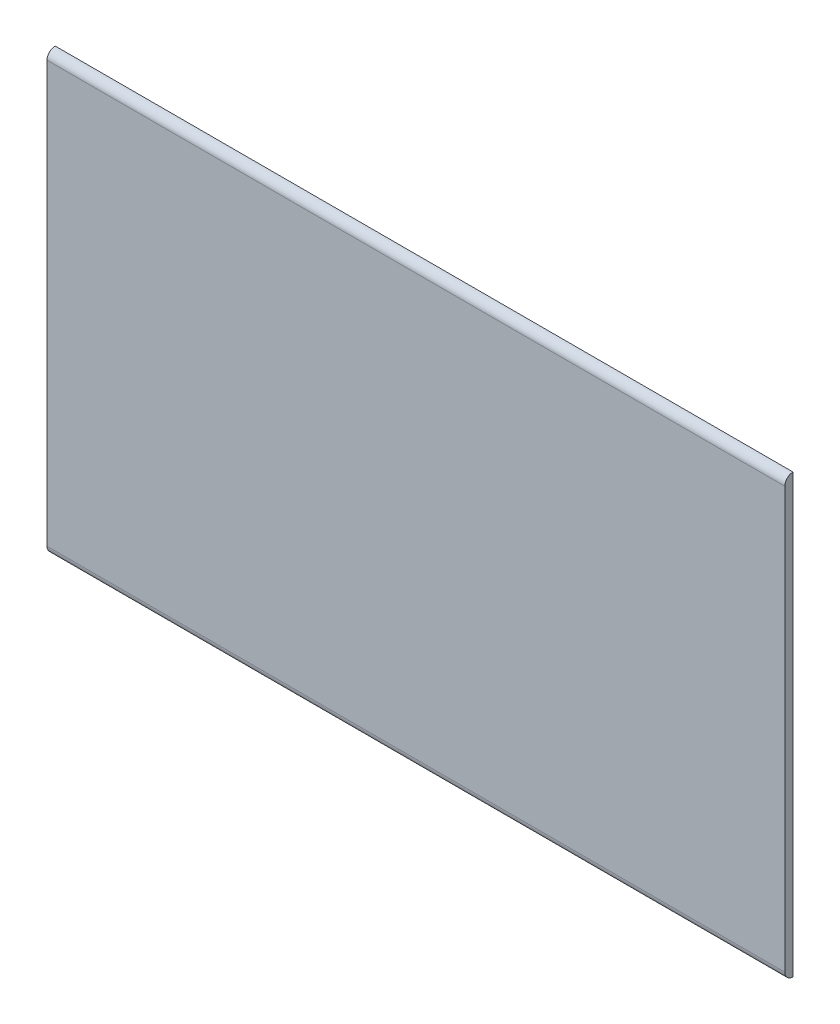
ISO-10303-21;
HEADER;
FILE_DESCRIPTION(('STEP AP214'),'2;1');
FILE_NAME('part.step','',(''),(''),'','','');
FILE_SCHEMA(('AUTOMOTIVE_DESIGN { 1 0 10303 214 1 1 1 1 }'));
ENDSEC;
DATA;
#1=APPLICATION_CONTEXT('core data for automotive mechanical design processes');
#2=APPLICATION_PROTOCOL_DEFINITION('international standard','automotive_design',2000,#1);
#3=PRODUCT_CONTEXT('',#1,'mechanical');
#4=PRODUCT('Part','Part','',(#3));
#5=PRODUCT_RELATED_PRODUCT_CATEGORY('part','',(#4));
#6=PRODUCT_DEFINITION_FORMATION('','',#4);
#7=PRODUCT_DEFINITION_CONTEXT('part definition',#1,'design');
#8=PRODUCT_DEFINITION('design','',#6,#7);
#9=PRODUCT_DEFINITION_SHAPE('','',#8);
#10=(LENGTH_UNIT() NAMED_UNIT(*) SI_UNIT(.MILLI.,.METRE.));
#11=(NAMED_UNIT(*) PLANE_ANGLE_UNIT() SI_UNIT($,.RADIAN.));
#12=(NAMED_UNIT(*) SI_UNIT($,.STERADIAN.) SOLID_ANGLE_UNIT());
#13=UNCERTAINTY_MEASURE_WITH_UNIT(LENGTH_MEASURE(1.E-05),#10,'distance_accuracy_value','');
#14=(GEOMETRIC_REPRESENTATION_CONTEXT(3) GLOBAL_UNCERTAINTY_ASSIGNED_CONTEXT((#13)) GLOBAL_UNIT_ASSIGNED_CONTEXT((#10,
#11,#12)) REPRESENTATION_CONTEXT('',''));
#15=CARTESIAN_POINT('',(0.,0.,0.));
#16=DIRECTION('',(0.,0.,1.));
#17=DIRECTION('',(1.,0.,0.));
#18=AXIS2_PLACEMENT_3D('',#15,#16,#17);
#19=CARTESIAN_POINT('',(13.000006969395,-8.00000066,1.1));
#20=DIRECTION('',(0.,0.,1.));
#21=DIRECTION('',(1.,0.,0.));
#22=AXIS2_PLACEMENT_3D('',#19,#20,#21);
#23=PLANE('',#22);
#24=DIRECTION('',(0.,1.,0.));
#25=VECTOR('',#24,1.);
#26=CARTESIAN_POINT('',(11.650006902079,-8.00000066,1.1));
#27=LINE('',#26,#25);
#28=CARTESIAN_POINT('',(11.6500069020788,-7.23000066,1.1));
#29=VERTEX_POINT('',#28);
#30=CARTESIAN_POINT('',(11.6500069693945,-8.77000077802075,1.1));
#31=VERTEX_POINT('',#30);
#32=EDGE_CURVE('E85',#29,#31,#27,.F.);
#33=ORIENTED_EDGE('',*,*,#32,.T.);
#34=DIRECTION('',(0.999999999999996,8.74227765734797E-08,0.));
#35=VECTOR('',#34,1.);
#36=CARTESIAN_POINT('',(12.20000703671,-8.77000072993797,1.1));
#37=LINE('',#36,#35);
#38=CARTESIAN_POINT('',(14.35000703671,-8.77000054197901,1.1));
#39=VERTEX_POINT('',#38);
#40=EDGE_CURVE('E82',#39,#31,#37,.F.);
#41=ORIENTED_EDGE('',*,*,#40,.F.);
#42=DIRECTION('',(-8.74227765734797E-08,0.999999999999996,0.));
#43=VECTOR('',#42,1.);
#44=CARTESIAN_POINT('',(14.35000688232,-7.003987697084,1.1));
#45=LINE('',#44,#43);
#46=CARTESIAN_POINT('',(14.3500069020788,-7.23000054197949,1.1));
#47=VERTEX_POINT('',#46);
#48=EDGE_CURVE('E66',#47,#39,#45,.F.);
#49=ORIENTED_EDGE('',*,*,#48,.F.);
#50=DIRECTION('',(-0.999999999999996,-8.74227765734797E-08,0.));
#51=VECTOR('',#50,1.);
#52=CARTESIAN_POINT('',(13.800006902079,-7.23000059006203,1.1));
#53=LINE('',#52,#51);
#54=EDGE_CURVE('E63',#29,#47,#53,.F.);
#55=ORIENTED_EDGE('',*,*,#54,.F.);
#56=EDGE_LOOP('',(#33,#41,#49,#55));
#57=FACE_BOUND('',#56,.T.);
#58=ADVANCED_FACE('F17',(#57),#23,.T.);
#59=CARTESIAN_POINT('',(13.800006902079,-7.230000590062,1.07));
#60=DIRECTION('',(-0.999999999999996,-8.74227765734797E-08,0.));
#61=DIRECTION('',(8.74227765734797E-08,-0.999999999999996,0.));
#62=AXIS2_PLACEMENT_3D('',#59,#60,#61);
#63=CYLINDRICAL_SURFACE('',#62,0.03);
#64=CARTESIAN_POINT('',(11.6500069020787,-7.23000077802097,1.07));
#65=DIRECTION('',(-0.999999999999996,-8.74227765734797E-08,0.));
#66=DIRECTION('',(8.74227765734797E-08,-0.999999999999996,0.));
#67=AXIS2_PLACEMENT_3D('',#64,#65,#66);
#68=CIRCLE('',#67,0.03);
#69=CARTESIAN_POINT('',(11.6500069693945,-7.20000077802098,1.07));
#70=VERTEX_POINT('',#69);
#71=EDGE_CURVE('E77',#29,#70,#68,.T.);
#72=ORIENTED_EDGE('',*,*,#71,.F.);
#73=ORIENTED_EDGE('',*,*,#54,.T.);
#74=CARTESIAN_POINT('',(14.350006902079,-7.23000054197947,1.07));
#75=DIRECTION('',(-0.999999999999996,-8.74227765734797E-08,0.));
#76=DIRECTION('',(8.74227765734797E-08,-0.999999999999996,0.));
#77=AXIS2_PLACEMENT_3D('',#74,#75,#76);
#78=CIRCLE('',#77,0.03);
#79=CARTESIAN_POINT('',(14.3500068994562,-7.20000066000024,1.07));
#80=VERTEX_POINT('',#79);
#81=EDGE_CURVE('E20',#80,#47,#78,.F.);
#82=ORIENTED_EDGE('',*,*,#81,.F.);
#83=DIRECTION('',(-1.,0.,0.));
#84=VECTOR('',#83,1.);
#85=CARTESIAN_POINT('',(13.000006969395,-7.200000778021,1.07));
#86=LINE('',#85,#84);
#87=EDGE_CURVE('E60',#70,#80,#86,.F.);
#88=ORIENTED_EDGE('',*,*,#87,.F.);
#89=EDGE_LOOP('',(#72,#73,#82,#88));
#90=FACE_BOUND('',#89,.T.);
#91=ADVANCED_FACE('F58',(#90),#63,.T.);
#92=CARTESIAN_POINT('',(14.35000688232,-7.003987697084,1.1));
#93=DIRECTION('',(0.999999999999996,8.74227765734797E-08,0.));
#94=DIRECTION('',(-8.74227765734797E-08,0.999999999999996,0.));
#95=AXIS2_PLACEMENT_3D('',#92,#93,#94);
#96=PLANE('',#95);
#97=CARTESIAN_POINT('',(14.3500070367103,-8.77000054197903,1.07));
#98=DIRECTION('',(0.999999999999996,8.74227765734797E-08,0.));
#99=DIRECTION('',(-8.74227765734797E-08,0.999999999999996,0.));
#100=AXIS2_PLACEMENT_3D('',#97,#98,#99);
#101=CIRCLE('',#100,0.03);
#102=CARTESIAN_POINT('',(14.3500069693945,-8.80000054197901,1.07));
#103=VERTEX_POINT('',#102);
#104=EDGE_CURVE('E71',#103,#39,#101,.F.);
#105=ORIENTED_EDGE('',*,*,#104,.F.);
#106=DIRECTION('',(0.,1.,0.));
#107=VECTOR('',#106,1.);
#108=CARTESIAN_POINT('',(14.350006899456,-8.00000066,1.07));
#109=LINE('',#108,#107);
#110=EDGE_CURVE('E68',#80,#103,#109,.F.);
#111=ORIENTED_EDGE('',*,*,#110,.F.);
#112=ORIENTED_EDGE('',*,*,#81,.T.);
#113=ORIENTED_EDGE('',*,*,#48,.T.);
#114=EDGE_LOOP('',(#105,#111,#112,#113));
#115=FACE_BOUND('',#114,.T.);
#116=ADVANCED_FACE('F69',(#115),#96,.T.);
#117=CARTESIAN_POINT('',(12.20000703671,-8.770000729938,1.07));
#118=DIRECTION('',(0.999999999999996,8.74227765734797E-08,0.));
#119=DIRECTION('',(-8.74227765734797E-08,0.999999999999996,0.));
#120=AXIS2_PLACEMENT_3D('',#117,#118,#119);
#121=CYLINDRICAL_SURFACE('',#120,0.03);
#122=CARTESIAN_POINT('',(11.65000703671,-8.77000077802053,1.07));
#123=DIRECTION('',(0.999999999999996,8.74227765734797E-08,0.));
#124=DIRECTION('',(-8.74227765734797E-08,0.999999999999996,0.));
#125=AXIS2_PLACEMENT_3D('',#122,#123,#124);
#126=CIRCLE('',#125,0.03);
#127=CARTESIAN_POINT('',(11.6500070393328,-8.80000065999976,1.07));
#128=VERTEX_POINT('',#127);
#129=EDGE_CURVE('E35',#128,#31,#126,.F.);
#130=ORIENTED_EDGE('',*,*,#129,.F.);
#131=DIRECTION('',(-1.,0.,0.));
#132=VECTOR('',#131,1.);
#133=CARTESIAN_POINT('',(13.000006969395,-8.800000541979,1.07));
#134=LINE('',#133,#132);
#135=EDGE_CURVE('E26',#103,#128,#134,.T.);
#136=ORIENTED_EDGE('',*,*,#135,.F.);
#137=ORIENTED_EDGE('',*,*,#104,.T.);
#138=ORIENTED_EDGE('',*,*,#40,.T.);
#139=EDGE_LOOP('',(#130,#136,#137,#138));
#140=FACE_BOUND('',#139,.T.);
#141=ADVANCED_FACE('F87',(#140),#121,.T.);
#142=CARTESIAN_POINT('',(11.650007056469,-8.996013622916,1.1));
#143=DIRECTION('',(-0.999999999999996,-8.74227765734797E-08,0.));
#144=DIRECTION('',(8.74227765734797E-08,-0.999999999999996,0.));
#145=AXIS2_PLACEMENT_3D('',#142,#143,#144);
#146=PLANE('',#145);
#147=ORIENTED_EDGE('',*,*,#129,.T.);
#148=ORIENTED_EDGE('',*,*,#32,.F.);
#149=ORIENTED_EDGE('',*,*,#71,.T.);
#150=DIRECTION('',(0.,1.,0.));
#151=VECTOR('',#150,1.);
#152=CARTESIAN_POINT('',(11.650007039333,-8.00000066,1.07));
#153=LINE('',#152,#151);
#154=EDGE_CURVE('E11',#128,#70,#153,.T.);
#155=ORIENTED_EDGE('',*,*,#154,.F.);
#156=EDGE_LOOP('',(#147,#148,#149,#155));
#157=FACE_BOUND('',#156,.T.);
#158=ADVANCED_FACE('F91',(#157),#146,.T.);
#159=CARTESIAN_POINT('',(13.000006969395,-8.00000066,1.07));
#160=DIRECTION('',(0.,0.,-1.));
#161=DIRECTION('',(-1.,0.,0.));
#162=AXIS2_PLACEMENT_3D('',#159,#160,#161);
#163=PLANE('',#162);
#164=ORIENTED_EDGE('',*,*,#135,.T.);
#165=ORIENTED_EDGE('',*,*,#154,.T.);
#166=ORIENTED_EDGE('',*,*,#87,.T.);
#167=ORIENTED_EDGE('',*,*,#110,.T.);
#168=EDGE_LOOP('',(#164,#165,#166,#167));
#169=FACE_BOUND('',#168,.T.);
#170=ADVANCED_FACE('F75',(#169),#163,.T.);
#171=CLOSED_SHELL('',(#58,#91,#116,#141,#158,#170));
#172=MANIFOLD_SOLID_BREP('B1',#171);
#173=ADVANCED_BREP_SHAPE_REPRESENTATION('',(#18,#172),#14);
#174=SHAPE_DEFINITION_REPRESENTATION(#9,#173);
ENDSEC;
END-ISO-10303-21;
